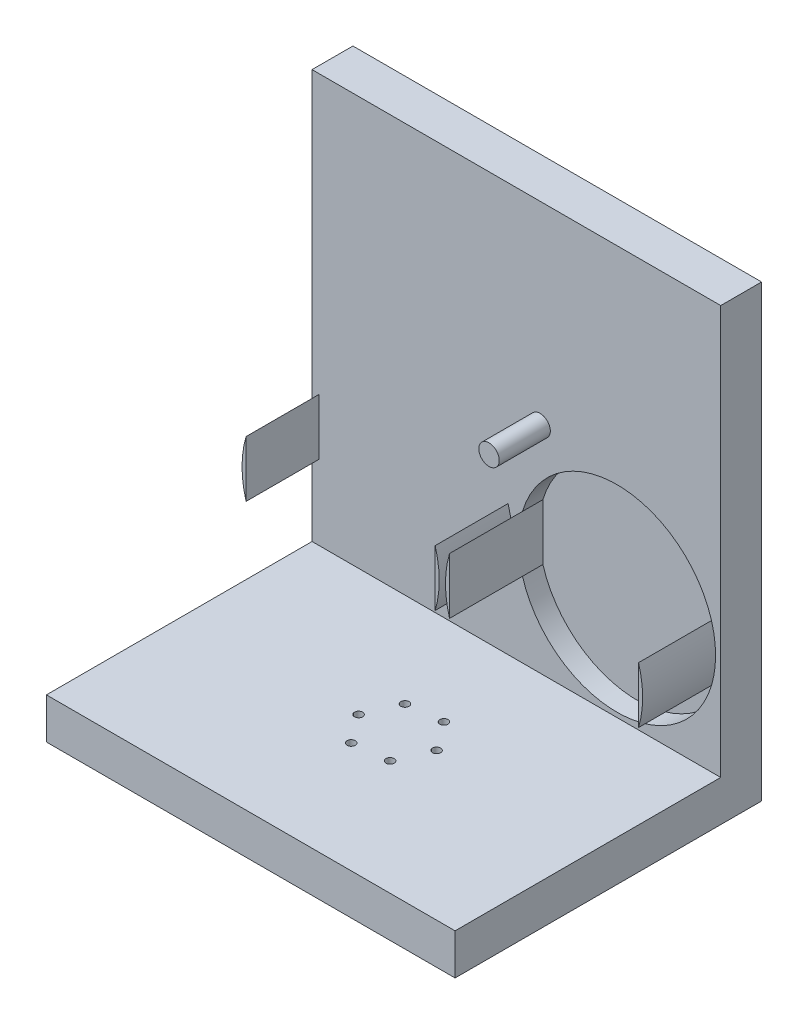
ISO-10303-21;
HEADER;
FILE_DESCRIPTION(('STEP AP214'),'2;1');
FILE_NAME('part.step','',(''),(''),'','','');
FILE_SCHEMA(('AUTOMOTIVE_DESIGN { 1 0 10303 214 1 1 1 1 }'));
ENDSEC;
DATA;
#1=APPLICATION_CONTEXT('core data for automotive mechanical design processes');
#2=APPLICATION_PROTOCOL_DEFINITION('international standard','automotive_design',2000,#1);
#3=PRODUCT_CONTEXT('',#1,'mechanical');
#4=PRODUCT('Part','Part','',(#3));
#5=PRODUCT_RELATED_PRODUCT_CATEGORY('part','',(#4));
#6=PRODUCT_DEFINITION_FORMATION('','',#4);
#7=PRODUCT_DEFINITION_CONTEXT('part definition',#1,'design');
#8=PRODUCT_DEFINITION('design','',#6,#7);
#9=PRODUCT_DEFINITION_SHAPE('','',#8);
#10=(LENGTH_UNIT() NAMED_UNIT(*) SI_UNIT(.MILLI.,.METRE.));
#11=(NAMED_UNIT(*) PLANE_ANGLE_UNIT() SI_UNIT($,.RADIAN.));
#12=(NAMED_UNIT(*) SI_UNIT($,.STERADIAN.) SOLID_ANGLE_UNIT());
#13=UNCERTAINTY_MEASURE_WITH_UNIT(LENGTH_MEASURE(1.E-05),#10,'distance_accuracy_value','');
#14=(GEOMETRIC_REPRESENTATION_CONTEXT(3) GLOBAL_UNCERTAINTY_ASSIGNED_CONTEXT((#13)) GLOBAL_UNIT_ASSIGNED_CONTEXT((#10,
#11,#12)) REPRESENTATION_CONTEXT('',''));
#15=CARTESIAN_POINT('',(0.,0.,0.));
#16=DIRECTION('',(0.,0.,1.));
#17=DIRECTION('',(1.,0.,0.));
#18=AXIS2_PLACEMENT_3D('',#15,#16,#17);
#19=CARTESIAN_POINT('',(0.,0.,20.));
#20=DIRECTION('',(0.,0.,1.));
#21=DIRECTION('',(1.,0.,0.));
#22=AXIS2_PLACEMENT_3D('',#19,#20,#21);
#23=PLANE('',#22);
#24=CARTESIAN_POINT('',(9.77133348525452,4.58020606529596,20.));
#25=DIRECTION('',(0.,0.,1.));
#26=DIRECTION('',(1.,0.,0.));
#27=AXIS2_PLACEMENT_3D('',#24,#25,#26);
#28=CIRCLE('',#27,5.);
#29=CARTESIAN_POINT('',(14.7713334852545,4.58020606529596,20.));
#30=VERTEX_POINT('',#29);
#31=EDGE_CURVE('E191',#30,#30,#28,.T.);
#32=ORIENTED_EDGE('',*,*,#31,.F.);
#33=EDGE_LOOP('',(#32));
#34=FACE_BOUND('',#33,.T.);
#35=CARTESIAN_POINT('',(47.3974122046126,-50.0366645851304,20.));
#36=DIRECTION('',(0.,0.,1.));
#37=DIRECTION('',(-1.,0.,0.));
#38=AXIS2_PLACEMENT_3D('',#35,#36,#37);
#39=CIRCLE('',#38,48.25);
#40=CARTESIAN_POINT('',(93.6474122046126,-36.2889375002628,20.));
#41=VERTEX_POINT('',#40);
#42=CARTESIAN_POINT('',(1.14741220461258,-36.2889375002629,20.));
#43=VERTEX_POINT('',#42);
#44=EDGE_CURVE('E169',#41,#43,#39,.T.);
#45=ORIENTED_EDGE('',*,*,#44,.F.);
#46=CARTESIAN_POINT('',(47.3974122046126,-50.0366645851304,20.));
#47=DIRECTION('',(0.,0.,1.));
#48=DIRECTION('',(-1.,0.,0.));
#49=AXIS2_PLACEMENT_3D('',#46,#47,#48);
#50=CIRCLE('',#49,48.25);
#51=CARTESIAN_POINT('',(93.6474122046126,-63.7843916699977,20.));
#52=VERTEX_POINT('',#51);
#53=EDGE_CURVE('E318',#52,#41,#50,.T.);
#54=ORIENTED_EDGE('',*,*,#53,.F.);
#55=CARTESIAN_POINT('',(47.3974122046126,-50.0366645851304,20.));
#56=DIRECTION('',(0.,0.,1.));
#57=DIRECTION('',(1.,0.,0.));
#58=AXIS2_PLACEMENT_3D('',#55,#56,#57);
#59=CIRCLE('',#58,48.25);
#60=CARTESIAN_POINT('',(1.14741220461261,-63.784391669998,20.));
#61=VERTEX_POINT('',#60);
#62=EDGE_CURVE('E187',#61,#52,#59,.T.);
#63=ORIENTED_EDGE('',*,*,#62,.F.);
#64=CARTESIAN_POINT('',(47.3974122046126,-50.0366645851304,20.));
#65=DIRECTION('',(0.,0.,1.));
#66=DIRECTION('',(1.,0.,0.));
#67=AXIS2_PLACEMENT_3D('',#64,#65,#66);
#68=CIRCLE('',#67,48.25);
#69=EDGE_CURVE('E321',#43,#61,#68,.T.);
#70=ORIENTED_EDGE('',*,*,#69,.F.);
#71=EDGE_LOOP('',(#45,#54,#63,#70));
#72=FACE_BOUND('',#71,.T.);
#73=DIRECTION('',(0.,1.,0.));
#74=VECTOR('',#73,1.);
#75=CARTESIAN_POINT('',(-98.4013600185397,-36.4686284248534,20.));
#76=LINE('',#75,#74);
#77=CARTESIAN_POINT('',(-98.4013600185397,-63.9640825945885,20.));
#78=VERTEX_POINT('',#77);
#79=CARTESIAN_POINT('',(-98.4013600185397,-36.4686284248534,20.));
#80=VERTEX_POINT('',#79);
#81=EDGE_CURVE('E301',#78,#80,#76,.T.);
#82=ORIENTED_EDGE('',*,*,#81,.F.);
#83=CARTESIAN_POINT('',(-52.1513600185397,-50.2163555097209,20.));
#84=DIRECTION('',(0.,0.,1.));
#85=DIRECTION('',(1.,0.,0.));
#86=AXIS2_PLACEMENT_3D('',#83,#84,#85);
#87=CIRCLE('',#86,48.25);
#88=EDGE_CURVE('E293',#80,#78,#87,.T.);
#89=ORIENTED_EDGE('',*,*,#88,.F.);
#90=EDGE_LOOP('',(#82,#89));
#91=FACE_BOUND('',#90,.T.);
#92=DIRECTION('',(0.,-1.,0.));
#93=VECTOR('',#92,1.);
#94=CARTESIAN_POINT('',(-5.90136001853973,-36.4686284248534,20.));
#95=LINE('',#94,#93);
#96=CARTESIAN_POINT('',(-5.90136001853973,-36.4686284248534,20.));
#97=VERTEX_POINT('',#96);
#98=CARTESIAN_POINT('',(-5.90136001853975,-63.9640825945885,20.));
#99=VERTEX_POINT('',#98);
#100=EDGE_CURVE('E288',#97,#99,#95,.T.);
#101=ORIENTED_EDGE('',*,*,#100,.F.);
#102=CARTESIAN_POINT('',(-52.1513600185397,-50.2163555097209,20.));
#103=DIRECTION('',(0.,0.,1.));
#104=DIRECTION('',(-1.,0.,0.));
#105=AXIS2_PLACEMENT_3D('',#102,#103,#104);
#106=CIRCLE('',#105,48.25);
#107=EDGE_CURVE('E290',#99,#97,#106,.T.);
#108=ORIENTED_EDGE('',*,*,#107,.F.);
#109=EDGE_LOOP('',(#101,#108));
#110=FACE_BOUND('',#109,.T.);
#111=DIRECTION('',(0.,-1.,0.));
#112=VECTOR('',#111,1.);
#113=CARTESIAN_POINT('',(-101.837901133192,99.46818513956,20.));
#114=LINE('',#113,#112);
#115=CARTESIAN_POINT('',(-101.837901133192,99.46818513956,20.));
#116=VERTEX_POINT('',#115);
#117=CARTESIAN_POINT('',(-101.837901133192,-100.53181486044,20.));
#118=VERTEX_POINT('',#117);
#119=EDGE_CURVE('E54',#116,#118,#114,.T.);
#120=ORIENTED_EDGE('',*,*,#119,.T.);
#121=DIRECTION('',(-1.,0.,0.));
#122=VECTOR('',#121,1.);
#123=CARTESIAN_POINT('',(-101.837901133192,-100.53181486044,20.));
#124=LINE('',#123,#122);
#125=CARTESIAN_POINT('',(98.1620988668081,-100.53181486044,20.));
#126=VERTEX_POINT('',#125);
#127=EDGE_CURVE('E58',#126,#118,#124,.T.);
#128=ORIENTED_EDGE('',*,*,#127,.F.);
#129=DIRECTION('',(0.,1.,0.));
#130=VECTOR('',#129,1.);
#131=CARTESIAN_POINT('',(98.162098866808,99.46818513956,20.));
#132=LINE('',#131,#130);
#133=CARTESIAN_POINT('',(98.162098866808,99.46818513956,20.));
#134=VERTEX_POINT('',#133);
#135=EDGE_CURVE('E339',#126,#134,#132,.T.);
#136=ORIENTED_EDGE('',*,*,#135,.T.);
#137=DIRECTION('',(-1.,0.,0.));
#138=VECTOR('',#137,1.);
#139=CARTESIAN_POINT('',(-101.837901133192,99.46818513956,20.));
#140=LINE('',#139,#138);
#141=EDGE_CURVE('E342',#134,#116,#140,.T.);
#142=ORIENTED_EDGE('',*,*,#141,.T.);
#143=EDGE_LOOP('',(#120,#128,#136,#142));
#144=FACE_BOUND('',#143,.T.);
#145=ADVANCED_FACE('F39',(#34,#72,#91,#110,#144),#23,.T.);
#146=CARTESIAN_POINT('',(-101.837901133192,99.46818513956,20.));
#147=DIRECTION('',(1.,0.,0.));
#148=DIRECTION('',(0.,1.,0.));
#149=AXIS2_PLACEMENT_3D('',#146,#147,#148);
#150=PLANE('',#149);
#151=DIRECTION('',(0.,-1.,0.));
#152=VECTOR('',#151,1.);
#153=CARTESIAN_POINT('',(-101.837901133192,99.46818513956,0.));
#154=LINE('',#153,#152);
#155=CARTESIAN_POINT('',(-101.837901133192,99.46818513956,0.));
#156=VERTEX_POINT('',#155);
#157=CARTESIAN_POINT('',(-101.837901133192,-120.529614348531,0.));
#158=VERTEX_POINT('',#157);
#159=EDGE_CURVE('E337',#156,#158,#154,.T.);
#160=ORIENTED_EDGE('',*,*,#159,.T.);
#161=DIRECTION('',(0.,0.,-1.));
#162=VECTOR('',#161,1.);
#163=CARTESIAN_POINT('',(-101.837901133192,-120.529614348531,20.));
#164=LINE('',#163,#162);
#165=CARTESIAN_POINT('',(-101.837901133192,-120.529614348531,20.));
#166=VERTEX_POINT('',#165);
#167=EDGE_CURVE('E270',#166,#158,#164,.T.);
#168=ORIENTED_EDGE('',*,*,#167,.F.);
#169=DIRECTION('',(0.,-1.,0.));
#170=VECTOR('',#169,1.);
#171=CARTESIAN_POINT('',(-101.837901133192,-100.53181486044,20.));
#172=LINE('',#171,#170);
#173=CARTESIAN_POINT('',(-101.837901133192,-120.53181486044,20.));
#174=VERTEX_POINT('',#173);
#175=EDGE_CURVE('E208',#166,#174,#172,.T.);
#176=ORIENTED_EDGE('',*,*,#175,.T.);
#177=DIRECTION('',(0.,0.,-1.));
#178=VECTOR('',#177,1.);
#179=CARTESIAN_POINT('',(-101.837901133192,-120.53181486044,150.));
#180=LINE('',#179,#178);
#181=CARTESIAN_POINT('',(-101.837901133192,-120.53181486044,150.));
#182=VERTEX_POINT('',#181);
#183=EDGE_CURVE('E266',#182,#174,#180,.T.);
#184=ORIENTED_EDGE('',*,*,#183,.F.);
#185=DIRECTION('',(0.,-1.,0.));
#186=VECTOR('',#185,1.);
#187=CARTESIAN_POINT('',(-101.837901133192,-100.53181486044,150.));
#188=LINE('',#187,#186);
#189=CARTESIAN_POINT('',(-101.837901133192,-100.53181486044,150.));
#190=VERTEX_POINT('',#189);
#191=EDGE_CURVE('E241',#190,#182,#188,.T.);
#192=ORIENTED_EDGE('',*,*,#191,.F.);
#193=DIRECTION('',(0.,0.,-1.));
#194=VECTOR('',#193,1.);
#195=CARTESIAN_POINT('',(-101.837901133192,-100.53181486044,150.));
#196=LINE('',#195,#194);
#197=EDGE_CURVE('E250',#190,#118,#196,.T.);
#198=ORIENTED_EDGE('',*,*,#197,.T.);
#199=ORIENTED_EDGE('',*,*,#119,.F.);
#200=DIRECTION('',(0.,0.,-1.));
#201=VECTOR('',#200,1.);
#202=CARTESIAN_POINT('',(-101.837901133192,99.46818513956,20.));
#203=LINE('',#202,#201);
#204=EDGE_CURVE('E47',#116,#156,#203,.T.);
#205=ORIENTED_EDGE('',*,*,#204,.T.);
#206=EDGE_LOOP('',(#160,#168,#176,#184,#192,#198,#199,#205));
#207=FACE_BOUND('',#206,.T.);
#208=ADVANCED_FACE('F41',(#207),#150,.F.);
#209=CARTESIAN_POINT('',(98.162098866808,99.46818513956,20.));
#210=DIRECTION('',(-1.,0.,0.));
#211=DIRECTION('',(0.,-1.,0.));
#212=AXIS2_PLACEMENT_3D('',#209,#210,#211);
#213=PLANE('',#212);
#214=DIRECTION('',(0.,1.,0.));
#215=VECTOR('',#214,1.);
#216=CARTESIAN_POINT('',(98.162098866808,99.46818513956,0.));
#217=LINE('',#216,#215);
#218=CARTESIAN_POINT('',(98.1620988668081,-120.529614348531,0.));
#219=VERTEX_POINT('',#218);
#220=CARTESIAN_POINT('',(98.162098866808,99.46818513956,0.));
#221=VERTEX_POINT('',#220);
#222=EDGE_CURVE('E345',#219,#221,#217,.T.);
#223=ORIENTED_EDGE('',*,*,#222,.T.);
#224=DIRECTION('',(0.,0.,-1.));
#225=VECTOR('',#224,1.);
#226=CARTESIAN_POINT('',(98.162098866808,99.46818513956,20.));
#227=LINE('',#226,#225);
#228=EDGE_CURVE('E11',#134,#221,#227,.T.);
#229=ORIENTED_EDGE('',*,*,#228,.F.);
#230=ORIENTED_EDGE('',*,*,#135,.F.);
#231=DIRECTION('',(0.,0.,-1.));
#232=VECTOR('',#231,1.);
#233=CARTESIAN_POINT('',(98.1620988668081,-100.53181486044,150.));
#234=LINE('',#233,#232);
#235=CARTESIAN_POINT('',(98.1620988668081,-100.53181486044,150.));
#236=VERTEX_POINT('',#235);
#237=EDGE_CURVE('E260',#236,#126,#234,.T.);
#238=ORIENTED_EDGE('',*,*,#237,.F.);
#239=DIRECTION('',(0.,1.,0.));
#240=VECTOR('',#239,1.);
#241=CARTESIAN_POINT('',(98.1620988668081,-100.53181486044,150.));
#242=LINE('',#241,#240);
#243=CARTESIAN_POINT('',(98.1620988668081,-120.53181486044,150.));
#244=VERTEX_POINT('',#243);
#245=EDGE_CURVE('E246',#244,#236,#242,.T.);
#246=ORIENTED_EDGE('',*,*,#245,.F.);
#247=DIRECTION('',(0.,0.,-1.));
#248=VECTOR('',#247,1.);
#249=CARTESIAN_POINT('',(98.1620988668081,-120.53181486044,150.));
#250=LINE('',#249,#248);
#251=CARTESIAN_POINT('',(98.1620988668081,-120.53181486044,20.));
#252=VERTEX_POINT('',#251);
#253=EDGE_CURVE('E263',#244,#252,#250,.T.);
#254=ORIENTED_EDGE('',*,*,#253,.T.);
#255=DIRECTION('',(0.,1.,0.));
#256=VECTOR('',#255,1.);
#257=CARTESIAN_POINT('',(98.1620988668081,-100.53181486044,20.));
#258=LINE('',#257,#256);
#259=CARTESIAN_POINT('',(98.1620988668081,-120.529614348531,20.));
#260=VERTEX_POINT('',#259);
#261=EDGE_CURVE('E254',#252,#260,#258,.T.);
#262=ORIENTED_EDGE('',*,*,#261,.T.);
#263=DIRECTION('',(0.,0.,-1.));
#264=VECTOR('',#263,1.);
#265=CARTESIAN_POINT('',(98.1620988668081,-120.529614348531,20.));
#266=LINE('',#265,#264);
#267=EDGE_CURVE('E269',#260,#219,#266,.T.);
#268=ORIENTED_EDGE('',*,*,#267,.T.);
#269=EDGE_LOOP('',(#223,#229,#230,#238,#246,#254,#262,#268));
#270=FACE_BOUND('',#269,.T.);
#271=ADVANCED_FACE('F379',(#270),#213,.F.);
#272=CARTESIAN_POINT('',(-101.837901133192,99.46818513956,20.));
#273=DIRECTION('',(0.,-1.,0.));
#274=DIRECTION('',(0.,0.,-1.));
#275=AXIS2_PLACEMENT_3D('',#272,#273,#274);
#276=PLANE('',#275);
#277=DIRECTION('',(-1.,0.,0.));
#278=VECTOR('',#277,1.);
#279=CARTESIAN_POINT('',(-101.837901133192,99.46818513956,0.));
#280=LINE('',#279,#278);
#281=EDGE_CURVE('E340',#221,#156,#280,.T.);
#282=ORIENTED_EDGE('',*,*,#281,.T.);
#283=ORIENTED_EDGE('',*,*,#204,.F.);
#284=ORIENTED_EDGE('',*,*,#141,.F.);
#285=ORIENTED_EDGE('',*,*,#228,.T.);
#286=EDGE_LOOP('',(#282,#283,#284,#285));
#287=FACE_BOUND('',#286,.T.);
#288=ADVANCED_FACE('F381',(#287),#276,.F.);
#289=CARTESIAN_POINT('',(0.,0.,0.));
#290=DIRECTION('',(0.,0.,1.));
#291=DIRECTION('',(1.,0.,0.));
#292=AXIS2_PLACEMENT_3D('',#289,#290,#291);
#293=PLANE('',#292);
#294=ORIENTED_EDGE('',*,*,#159,.F.);
#295=ORIENTED_EDGE('',*,*,#281,.F.);
#296=ORIENTED_EDGE('',*,*,#222,.F.);
#297=DIRECTION('',(1.,0.,0.));
#298=VECTOR('',#297,1.);
#299=CARTESIAN_POINT('',(-101.837901133192,-120.529614348531,0.));
#300=LINE('',#299,#298);
#301=EDGE_CURVE('E276',#158,#219,#300,.T.);
#302=ORIENTED_EDGE('',*,*,#301,.F.);
#303=EDGE_LOOP('',(#294,#295,#296,#302));
#304=FACE_BOUND('',#303,.T.);
#305=ADVANCED_FACE('F357',(#304),#293,.F.);
#306=CARTESIAN_POINT('',(47.3974122046126,-50.0366645851304,55.7));
#307=DIRECTION('',(0.,0.,-1.));
#308=DIRECTION('',(-1.,0.,0.));
#309=AXIS2_PLACEMENT_3D('',#306,#307,#308);
#310=CYLINDRICAL_SURFACE('',#309,48.25);
#311=ORIENTED_EDGE('',*,*,#69,.T.);
#312=DIRECTION('',(0.,0.,-1.));
#313=VECTOR('',#312,1.);
#314=CARTESIAN_POINT('',(1.14741220461261,-63.784391669998,55.7));
#315=LINE('',#314,#313);
#316=CARTESIAN_POINT('',(1.14741220461261,-63.784391669998,55.7));
#317=VERTEX_POINT('',#316);
#318=EDGE_CURVE('E335',#317,#61,#315,.T.);
#319=ORIENTED_EDGE('',*,*,#318,.F.);
#320=CARTESIAN_POINT('',(47.3974122046126,-50.0366645851304,55.7));
#321=DIRECTION('',(0.,0.,1.));
#322=DIRECTION('',(1.,0.,0.));
#323=AXIS2_PLACEMENT_3D('',#320,#321,#322);
#324=CIRCLE('',#323,48.25);
#325=CARTESIAN_POINT('',(1.14741220461258,-36.2889375002629,55.7));
#326=VERTEX_POINT('',#325);
#327=EDGE_CURVE('E326',#326,#317,#324,.T.);
#328=ORIENTED_EDGE('',*,*,#327,.F.);
#329=DIRECTION('',(0.,0.,-1.));
#330=VECTOR('',#329,1.);
#331=CARTESIAN_POINT('',(1.14741220461258,-36.2889375002629,55.7));
#332=LINE('',#331,#330);
#333=EDGE_CURVE('E331',#326,#43,#332,.T.);
#334=ORIENTED_EDGE('',*,*,#333,.T.);
#335=EDGE_LOOP('',(#311,#319,#328,#334));
#336=FACE_BOUND('',#335,.T.);
#337=ADVANCED_FACE('F388',(#336),#310,.T.);
#338=CARTESIAN_POINT('',(1.14741220461258,-36.2889375002629,55.7));
#339=DIRECTION('',(-1.,0.,0.));
#340=DIRECTION('',(0.,-1.,0.));
#341=AXIS2_PLACEMENT_3D('',#338,#339,#340);
#342=PLANE('',#341);
#343=ORIENTED_EDGE('',*,*,#318,.T.);
#344=DIRECTION('',(0.,0.,1.));
#345=VECTOR('',#344,1.);
#346=CARTESIAN_POINT('',(1.14741220461261,-63.784391669998,10.));
#347=LINE('',#346,#345);
#348=CARTESIAN_POINT('',(1.14741220461261,-63.784391669998,10.));
#349=VERTEX_POINT('',#348);
#350=EDGE_CURVE('E173',#349,#61,#347,.T.);
#351=ORIENTED_EDGE('',*,*,#350,.F.);
#352=DIRECTION('',(0.,-1.,0.));
#353=VECTOR('',#352,1.);
#354=CARTESIAN_POINT('',(1.14741220461258,-36.2889375002629,10.));
#355=LINE('',#354,#353);
#356=CARTESIAN_POINT('',(1.14741220461258,-36.2889375002629,10.));
#357=VERTEX_POINT('',#356);
#358=EDGE_CURVE('E177',#357,#349,#355,.T.);
#359=ORIENTED_EDGE('',*,*,#358,.F.);
#360=DIRECTION('',(0.,0.,1.));
#361=VECTOR('',#360,1.);
#362=CARTESIAN_POINT('',(1.14741220461258,-36.2889375002629,10.));
#363=LINE('',#362,#361);
#364=EDGE_CURVE('E162',#357,#43,#363,.T.);
#365=ORIENTED_EDGE('',*,*,#364,.T.);
#366=ORIENTED_EDGE('',*,*,#333,.F.);
#367=DIRECTION('',(0.,1.,0.));
#368=VECTOR('',#367,1.);
#369=CARTESIAN_POINT('',(1.14741220461258,-36.2889375002629,55.7));
#370=LINE('',#369,#368);
#371=EDGE_CURVE('E329',#317,#326,#370,.T.);
#372=ORIENTED_EDGE('',*,*,#371,.F.);
#373=EDGE_LOOP('',(#343,#351,#359,#365,#366,#372));
#374=FACE_BOUND('',#373,.T.);
#375=ADVANCED_FACE('F179',(#374),#342,.F.);
#376=CARTESIAN_POINT('',(47.3974122046126,-50.0366645851304,55.7));
#377=DIRECTION('',(0.,0.,1.));
#378=DIRECTION('',(1.,0.,0.));
#379=AXIS2_PLACEMENT_3D('',#376,#377,#378);
#380=PLANE('',#379);
#381=ORIENTED_EDGE('',*,*,#327,.T.);
#382=ORIENTED_EDGE('',*,*,#371,.T.);
#383=EDGE_LOOP('',(#381,#382));
#384=FACE_BOUND('',#383,.T.);
#385=ADVANCED_FACE('F407',(#384),#380,.T.);
#386=CARTESIAN_POINT('',(47.3974122046126,-50.0366645851304,55.7));
#387=DIRECTION('',(0.,0.,-1.));
#388=DIRECTION('',(-1.,0.,0.));
#389=AXIS2_PLACEMENT_3D('',#386,#387,#388);
#390=CYLINDRICAL_SURFACE('',#389,48.25);
#391=ORIENTED_EDGE('',*,*,#53,.T.);
#392=DIRECTION('',(0.,0.,-1.));
#393=VECTOR('',#392,1.);
#394=CARTESIAN_POINT('',(93.6474122046126,-36.2889375002629,55.7));
#395=LINE('',#394,#393);
#396=CARTESIAN_POINT('',(93.6474122046126,-36.2889375002629,55.7));
#397=VERTEX_POINT('',#396);
#398=EDGE_CURVE('E311',#397,#41,#395,.T.);
#399=ORIENTED_EDGE('',*,*,#398,.F.);
#400=CARTESIAN_POINT('',(47.3974122046126,-50.0366645851304,55.7));
#401=DIRECTION('',(0.,0.,1.));
#402=DIRECTION('',(-1.,0.,0.));
#403=AXIS2_PLACEMENT_3D('',#400,#401,#402);
#404=CIRCLE('',#403,48.25);
#405=CARTESIAN_POINT('',(93.6474122046126,-63.7843916699977,55.7));
#406=VERTEX_POINT('',#405);
#407=EDGE_CURVE('E322',#406,#397,#404,.T.);
#408=ORIENTED_EDGE('',*,*,#407,.F.);
#409=DIRECTION('',(0.,0.,-1.));
#410=VECTOR('',#409,1.);
#411=CARTESIAN_POINT('',(93.6474122046126,-63.7843916699977,55.7));
#412=LINE('',#411,#410);
#413=EDGE_CURVE('E314',#406,#52,#412,.T.);
#414=ORIENTED_EDGE('',*,*,#413,.T.);
#415=EDGE_LOOP('',(#391,#399,#408,#414));
#416=FACE_BOUND('',#415,.T.);
#417=ADVANCED_FACE('F409',(#416),#390,.T.);
#418=CARTESIAN_POINT('',(93.6474122046126,-36.2889375002629,55.7));
#419=DIRECTION('',(1.,0.,0.));
#420=DIRECTION('',(0.,1.,0.));
#421=AXIS2_PLACEMENT_3D('',#418,#419,#420);
#422=PLANE('',#421);
#423=ORIENTED_EDGE('',*,*,#398,.T.);
#424=DIRECTION('',(0.,0.,1.));
#425=VECTOR('',#424,1.);
#426=CARTESIAN_POINT('',(93.6474122046126,-36.2889375002628,10.));
#427=LINE('',#426,#425);
#428=CARTESIAN_POINT('',(93.6474122046126,-36.2889375002628,10.));
#429=VERTEX_POINT('',#428);
#430=EDGE_CURVE('E198',#429,#41,#427,.T.);
#431=ORIENTED_EDGE('',*,*,#430,.F.);
#432=DIRECTION('',(0.,1.,0.));
#433=VECTOR('',#432,1.);
#434=CARTESIAN_POINT('',(93.6474122046126,-36.2889375002628,10.));
#435=LINE('',#434,#433);
#436=CARTESIAN_POINT('',(93.6474122046126,-63.7843916699978,10.));
#437=VERTEX_POINT('',#436);
#438=EDGE_CURVE('E174',#437,#429,#435,.T.);
#439=ORIENTED_EDGE('',*,*,#438,.F.);
#440=DIRECTION('',(0.,0.,1.));
#441=VECTOR('',#440,1.);
#442=CARTESIAN_POINT('',(93.6474122046126,-63.7843916699978,10.));
#443=LINE('',#442,#441);
#444=EDGE_CURVE('E201',#437,#52,#443,.T.);
#445=ORIENTED_EDGE('',*,*,#444,.T.);
#446=ORIENTED_EDGE('',*,*,#413,.F.);
#447=DIRECTION('',(0.,-1.,0.));
#448=VECTOR('',#447,1.);
#449=CARTESIAN_POINT('',(93.6474122046126,-36.2889375002629,55.7));
#450=LINE('',#449,#448);
#451=EDGE_CURVE('E317',#397,#406,#450,.T.);
#452=ORIENTED_EDGE('',*,*,#451,.F.);
#453=EDGE_LOOP('',(#423,#431,#439,#445,#446,#452));
#454=FACE_BOUND('',#453,.T.);
#455=ADVANCED_FACE('F415',(#454),#422,.F.);
#456=CARTESIAN_POINT('',(47.3974122046126,-50.0366645851304,55.7));
#457=DIRECTION('',(0.,0.,-1.));
#458=DIRECTION('',(-1.,0.,0.));
#459=AXIS2_PLACEMENT_3D('',#456,#457,#458);
#460=PLANE('',#459);
#461=ORIENTED_EDGE('',*,*,#407,.T.);
#462=ORIENTED_EDGE('',*,*,#451,.T.);
#463=EDGE_LOOP('',(#461,#462));
#464=FACE_BOUND('',#463,.T.);
#465=ADVANCED_FACE('F411',(#464),#460,.F.);
#466=CARTESIAN_POINT('',(-52.1513600185397,-50.2163555097209,55.7));
#467=DIRECTION('',(0.,0.,-1.));
#468=DIRECTION('',(-1.,0.,0.));
#469=AXIS2_PLACEMENT_3D('',#466,#467,#468);
#470=CYLINDRICAL_SURFACE('',#469,48.25);
#471=ORIENTED_EDGE('',*,*,#88,.T.);
#472=DIRECTION('',(0.,0.,-1.));
#473=VECTOR('',#472,1.);
#474=CARTESIAN_POINT('',(-98.4013600185397,-63.9640825945885,55.7));
#475=LINE('',#474,#473);
#476=CARTESIAN_POINT('',(-98.4013600185397,-63.9640825945885,55.7));
#477=VERTEX_POINT('',#476);
#478=EDGE_CURVE('E308',#477,#78,#475,.T.);
#479=ORIENTED_EDGE('',*,*,#478,.F.);
#480=CARTESIAN_POINT('',(-52.1513600185397,-50.2163555097209,55.7));
#481=DIRECTION('',(0.,0.,1.));
#482=DIRECTION('',(1.,0.,0.));
#483=AXIS2_PLACEMENT_3D('',#480,#481,#482);
#484=CIRCLE('',#483,48.25);
#485=CARTESIAN_POINT('',(-98.4013600185397,-36.4686284248534,55.7));
#486=VERTEX_POINT('',#485);
#487=EDGE_CURVE('E297',#486,#477,#484,.T.);
#488=ORIENTED_EDGE('',*,*,#487,.F.);
#489=DIRECTION('',(0.,0.,-1.));
#490=VECTOR('',#489,1.);
#491=CARTESIAN_POINT('',(-98.4013600185397,-36.4686284248534,55.7));
#492=LINE('',#491,#490);
#493=EDGE_CURVE('E303',#486,#80,#492,.T.);
#494=ORIENTED_EDGE('',*,*,#493,.T.);
#495=EDGE_LOOP('',(#471,#479,#488,#494));
#496=FACE_BOUND('',#495,.T.);
#497=ADVANCED_FACE('F414',(#496),#470,.T.);
#498=CARTESIAN_POINT('',(-98.4013600185397,-36.4686284248534,55.7));
#499=DIRECTION('',(-1.,0.,0.));
#500=DIRECTION('',(0.,-1.,0.));
#501=AXIS2_PLACEMENT_3D('',#498,#499,#500);
#502=PLANE('',#501);
#503=ORIENTED_EDGE('',*,*,#81,.T.);
#504=ORIENTED_EDGE('',*,*,#493,.F.);
#505=DIRECTION('',(0.,1.,0.));
#506=VECTOR('',#505,1.);
#507=CARTESIAN_POINT('',(-98.4013600185397,-36.4686284248534,55.7));
#508=LINE('',#507,#506);
#509=EDGE_CURVE('E300',#477,#486,#508,.T.);
#510=ORIENTED_EDGE('',*,*,#509,.F.);
#511=ORIENTED_EDGE('',*,*,#478,.T.);
#512=EDGE_LOOP('',(#503,#504,#510,#511));
#513=FACE_BOUND('',#512,.T.);
#514=ADVANCED_FACE('F425',(#513),#502,.F.);
#515=CARTESIAN_POINT('',(-52.1513600185397,-50.2163555097209,55.7));
#516=DIRECTION('',(0.,0.,1.));
#517=DIRECTION('',(1.,0.,0.));
#518=AXIS2_PLACEMENT_3D('',#515,#516,#517);
#519=PLANE('',#518);
#520=ORIENTED_EDGE('',*,*,#487,.T.);
#521=ORIENTED_EDGE('',*,*,#509,.T.);
#522=EDGE_LOOP('',(#520,#521));
#523=FACE_BOUND('',#522,.T.);
#524=ADVANCED_FACE('F429',(#523),#519,.T.);
#525=CARTESIAN_POINT('',(-52.1513600185397,-50.2163555097209,55.7));
#526=DIRECTION('',(0.,0.,-1.));
#527=DIRECTION('',(-1.,0.,0.));
#528=AXIS2_PLACEMENT_3D('',#525,#526,#527);
#529=CYLINDRICAL_SURFACE('',#528,48.25);
#530=ORIENTED_EDGE('',*,*,#107,.T.);
#531=DIRECTION('',(0.,0.,-1.));
#532=VECTOR('',#531,1.);
#533=CARTESIAN_POINT('',(-5.90136001853973,-36.4686284248534,55.7));
#534=LINE('',#533,#532);
#535=CARTESIAN_POINT('',(-5.90136001853973,-36.4686284248534,55.7));
#536=VERTEX_POINT('',#535);
#537=EDGE_CURVE('E279',#536,#97,#534,.T.);
#538=ORIENTED_EDGE('',*,*,#537,.F.);
#539=CARTESIAN_POINT('',(-52.1513600185397,-50.2163555097209,55.7));
#540=DIRECTION('',(0.,0.,1.));
#541=DIRECTION('',(-1.,0.,0.));
#542=AXIS2_PLACEMENT_3D('',#539,#540,#541);
#543=CIRCLE('',#542,48.25);
#544=CARTESIAN_POINT('',(-5.90136001853975,-63.9640825945885,55.7));
#545=VERTEX_POINT('',#544);
#546=EDGE_CURVE('E291',#545,#536,#543,.T.);
#547=ORIENTED_EDGE('',*,*,#546,.F.);
#548=DIRECTION('',(0.,0.,-1.));
#549=VECTOR('',#548,1.);
#550=CARTESIAN_POINT('',(-5.90136001853975,-63.9640825945885,55.7));
#551=LINE('',#550,#549);
#552=EDGE_CURVE('E284',#545,#99,#551,.T.);
#553=ORIENTED_EDGE('',*,*,#552,.T.);
#554=EDGE_LOOP('',(#530,#538,#547,#553));
#555=FACE_BOUND('',#554,.T.);
#556=ADVANCED_FACE('F433',(#555),#529,.T.);
#557=CARTESIAN_POINT('',(-5.90136001853973,-36.4686284248534,55.7));
#558=DIRECTION('',(1.,0.,0.));
#559=DIRECTION('',(0.,1.,0.));
#560=AXIS2_PLACEMENT_3D('',#557,#558,#559);
#561=PLANE('',#560);
#562=ORIENTED_EDGE('',*,*,#100,.T.);
#563=ORIENTED_EDGE('',*,*,#552,.F.);
#564=DIRECTION('',(0.,-1.,0.));
#565=VECTOR('',#564,1.);
#566=CARTESIAN_POINT('',(-5.90136001853973,-36.4686284248534,55.7));
#567=LINE('',#566,#565);
#568=EDGE_CURVE('E287',#536,#545,#567,.T.);
#569=ORIENTED_EDGE('',*,*,#568,.F.);
#570=ORIENTED_EDGE('',*,*,#537,.T.);
#571=EDGE_LOOP('',(#562,#563,#569,#570));
#572=FACE_BOUND('',#571,.T.);
#573=ADVANCED_FACE('F438',(#572),#561,.F.);
#574=CARTESIAN_POINT('',(-52.1513600185397,-50.2163555097209,55.7));
#575=DIRECTION('',(0.,0.,-1.));
#576=DIRECTION('',(-1.,0.,0.));
#577=AXIS2_PLACEMENT_3D('',#574,#575,#576);
#578=PLANE('',#577);
#579=ORIENTED_EDGE('',*,*,#546,.T.);
#580=ORIENTED_EDGE('',*,*,#568,.T.);
#581=EDGE_LOOP('',(#579,#580));
#582=FACE_BOUND('',#581,.T.);
#583=ADVANCED_FACE('F435',(#582),#578,.F.);
#584=CARTESIAN_POINT('',(-101.837901133192,-120.529614348531,20.));
#585=DIRECTION('',(0.,-1.,0.));
#586=DIRECTION('',(0.,0.,-1.));
#587=AXIS2_PLACEMENT_3D('',#584,#585,#586);
#588=PLANE('',#587);
#589=ORIENTED_EDGE('',*,*,#267,.F.);
#590=DIRECTION('',(1.,0.,0.));
#591=VECTOR('',#590,1.);
#592=CARTESIAN_POINT('',(-101.837901133192,-120.529614348531,20.));
#593=LINE('',#592,#591);
#594=EDGE_CURVE('E273',#166,#260,#593,.T.);
#595=ORIENTED_EDGE('',*,*,#594,.F.);
#596=ORIENTED_EDGE('',*,*,#167,.T.);
#597=ORIENTED_EDGE('',*,*,#301,.T.);
#598=EDGE_LOOP('',(#589,#595,#596,#597));
#599=FACE_BOUND('',#598,.T.);
#600=ADVANCED_FACE('F359',(#599),#588,.T.);
#601=CARTESIAN_POINT('',(-101.837901133192,-120.53181486044,150.));
#602=DIRECTION('',(0.,1.,0.));
#603=DIRECTION('',(0.,0.,1.));
#604=AXIS2_PLACEMENT_3D('',#601,#602,#603);
#605=PLANE('',#604);
#606=CARTESIAN_POINT('',(-17.1398512286904,-120.53181486044,81.946278463723));
#607=DIRECTION('',(0.,1.,0.));
#608=DIRECTION('',(0.,0.,1.));
#609=AXIS2_PLACEMENT_3D('',#606,#607,#608);
#610=CIRCLE('',#609,2.);
#611=CARTESIAN_POINT('',(-17.1398512286904,-120.53181486044,83.946278463723));
#612=VERTEX_POINT('',#611);
#613=EDGE_CURVE('E205',#612,#612,#610,.T.);
#614=ORIENTED_EDGE('',*,*,#613,.T.);
#615=EDGE_LOOP('',(#614));
#616=FACE_BOUND('',#615,.T.);
#617=CARTESIAN_POINT('',(-6.88439902192238,-120.53181486044,95.8166858129935));
#618=DIRECTION('',(0.,1.,0.));
#619=DIRECTION('',(0.,0.,1.));
#620=AXIS2_PLACEMENT_3D('',#617,#618,#619);
#621=CIRCLE('',#620,2.00000000000001);
#622=CARTESIAN_POINT('',(-6.88439902192238,-120.53181486044,97.8166858129935));
#623=VERTEX_POINT('',#622);
#624=EDGE_CURVE('E200',#623,#623,#621,.T.);
#625=ORIENTED_EDGE('',*,*,#624,.T.);
#626=EDGE_LOOP('',(#625));
#627=FACE_BOUND('',#626,.T.);
#628=CARTESIAN_POINT('',(10.2554522067683,-120.53181486044,93.8704073492705));
#629=DIRECTION('',(0.,1.,0.));
#630=DIRECTION('',(0.,0.,1.));
#631=AXIS2_PLACEMENT_3D('',#628,#629,#630);
#632=CIRCLE('',#631,2.);
#633=CARTESIAN_POINT('',(10.2554522067683,-120.53181486044,95.8704073492705));
#634=VERTEX_POINT('',#633);
#635=EDGE_CURVE('E216',#634,#634,#632,.T.);
#636=ORIENTED_EDGE('',*,*,#635,.T.);
#637=EDGE_LOOP('',(#636));
#638=FACE_BOUND('',#637,.T.);
#639=CARTESIAN_POINT('',(17.1398512286909,-120.53181486044,78.053721536277));
#640=DIRECTION('',(0.,1.,0.));
#641=DIRECTION('',(0.,0.,1.));
#642=AXIS2_PLACEMENT_3D('',#639,#640,#641);
#643=CIRCLE('',#642,2.00000000000001);
#644=CARTESIAN_POINT('',(17.1398512286909,-120.53181486044,80.053721536277));
#645=VERTEX_POINT('',#644);
#646=EDGE_CURVE('E233',#645,#645,#643,.T.);
#647=ORIENTED_EDGE('',*,*,#646,.T.);
#648=EDGE_LOOP('',(#647));
#649=FACE_BOUND('',#648,.T.);
#650=CARTESIAN_POINT('',(6.88439902192283,-120.53181486044,64.1833141870065));
#651=DIRECTION('',(0.,1.,0.));
#652=DIRECTION('',(0.,0.,1.));
#653=AXIS2_PLACEMENT_3D('',#650,#651,#652);
#654=CIRCLE('',#653,2.);
#655=CARTESIAN_POINT('',(6.88439902192283,-120.53181486044,66.1833141870065));
#656=VERTEX_POINT('',#655);
#657=EDGE_CURVE('E227',#656,#656,#654,.T.);
#658=ORIENTED_EDGE('',*,*,#657,.T.);
#659=EDGE_LOOP('',(#658));
#660=FACE_BOUND('',#659,.T.);
#661=CARTESIAN_POINT('',(-10.2554522067678,-120.53181486044,66.1295926507295));
#662=DIRECTION('',(0.,1.,0.));
#663=DIRECTION('',(0.,0.,1.));
#664=AXIS2_PLACEMENT_3D('',#661,#662,#663);
#665=CIRCLE('',#664,2.00000000000001);
#666=CARTESIAN_POINT('',(-10.2554522067678,-120.53181486044,68.1295926507295));
#667=VERTEX_POINT('',#666);
#668=EDGE_CURVE('E221',#667,#667,#665,.T.);
#669=ORIENTED_EDGE('',*,*,#668,.T.);
#670=EDGE_LOOP('',(#669));
#671=FACE_BOUND('',#670,.T.);
#672=DIRECTION('',(1.,0.,0.));
#673=VECTOR('',#672,1.);
#674=CARTESIAN_POINT('',(-101.837901133192,-120.53181486044,20.));
#675=LINE('',#674,#673);
#676=EDGE_CURVE('E252',#174,#252,#675,.T.);
#677=ORIENTED_EDGE('',*,*,#676,.T.);
#678=ORIENTED_EDGE('',*,*,#253,.F.);
#679=DIRECTION('',(1.,0.,0.));
#680=VECTOR('',#679,1.);
#681=CARTESIAN_POINT('',(-101.837901133192,-120.53181486044,150.));
#682=LINE('',#681,#680);
#683=EDGE_CURVE('E244',#182,#244,#682,.T.);
#684=ORIENTED_EDGE('',*,*,#683,.F.);
#685=ORIENTED_EDGE('',*,*,#183,.T.);
#686=EDGE_LOOP('',(#677,#678,#684,#685));
#687=FACE_BOUND('',#686,.T.);
#688=ADVANCED_FACE('F368',(#616,#627,#638,#649,#660,#671,#687),#605,.F.);
#689=CARTESIAN_POINT('',(-101.837901133192,-100.53181486044,150.));
#690=DIRECTION('',(0.,-1.,0.));
#691=DIRECTION('',(0.,0.,-1.));
#692=AXIS2_PLACEMENT_3D('',#689,#690,#691);
#693=PLANE('',#692);
#694=CARTESIAN_POINT('',(-17.1398512286904,-100.53181486044,81.946278463723));
#695=DIRECTION('',(0.,1.,0.));
#696=DIRECTION('',(0.,0.,1.));
#697=AXIS2_PLACEMENT_3D('',#694,#695,#696);
#698=CIRCLE('',#697,2.);
#699=CARTESIAN_POINT('',(-17.1398512286904,-100.53181486044,83.946278463723));
#700=VERTEX_POINT('',#699);
#701=EDGE_CURVE('E209',#700,#700,#698,.T.);
#702=ORIENTED_EDGE('',*,*,#701,.F.);
#703=EDGE_LOOP('',(#702));
#704=FACE_BOUND('',#703,.T.);
#705=CARTESIAN_POINT('',(-6.88439902192238,-100.53181486044,95.8166858129935));
#706=DIRECTION('',(0.,1.,0.));
#707=DIRECTION('',(0.,0.,1.));
#708=AXIS2_PLACEMENT_3D('',#705,#706,#707);
#709=CIRCLE('',#708,2.00000000000001);
#710=CARTESIAN_POINT('',(-6.88439902192238,-100.53181486044,97.8166858129935));
#711=VERTEX_POINT('',#710);
#712=EDGE_CURVE('E213',#711,#711,#709,.T.);
#713=ORIENTED_EDGE('',*,*,#712,.F.);
#714=EDGE_LOOP('',(#713));
#715=FACE_BOUND('',#714,.T.);
#716=CARTESIAN_POINT('',(10.2554522067683,-100.53181486044,93.8704073492705));
#717=DIRECTION('',(0.,1.,0.));
#718=DIRECTION('',(0.,0.,1.));
#719=AXIS2_PLACEMENT_3D('',#716,#717,#718);
#720=CIRCLE('',#719,2.);
#721=CARTESIAN_POINT('',(10.2554522067683,-100.53181486044,95.8704073492705));
#722=VERTEX_POINT('',#721);
#723=EDGE_CURVE('E236',#722,#722,#720,.T.);
#724=ORIENTED_EDGE('',*,*,#723,.F.);
#725=EDGE_LOOP('',(#724));
#726=FACE_BOUND('',#725,.T.);
#727=CARTESIAN_POINT('',(17.1398512286909,-100.53181486044,78.053721536277));
#728=DIRECTION('',(0.,1.,0.));
#729=DIRECTION('',(0.,0.,1.));
#730=AXIS2_PLACEMENT_3D('',#727,#728,#729);
#731=CIRCLE('',#730,2.00000000000001);
#732=CARTESIAN_POINT('',(17.1398512286909,-100.53181486044,80.053721536277));
#733=VERTEX_POINT('',#732);
#734=EDGE_CURVE('E230',#733,#733,#731,.T.);
#735=ORIENTED_EDGE('',*,*,#734,.F.);
#736=EDGE_LOOP('',(#735));
#737=FACE_BOUND('',#736,.T.);
#738=CARTESIAN_POINT('',(6.88439902192283,-100.53181486044,64.1833141870065));
#739=DIRECTION('',(0.,1.,0.));
#740=DIRECTION('',(0.,0.,1.));
#741=AXIS2_PLACEMENT_3D('',#738,#739,#740);
#742=CIRCLE('',#741,2.);
#743=CARTESIAN_POINT('',(6.88439902192283,-100.53181486044,66.1833141870065));
#744=VERTEX_POINT('',#743);
#745=EDGE_CURVE('E224',#744,#744,#742,.T.);
#746=ORIENTED_EDGE('',*,*,#745,.F.);
#747=EDGE_LOOP('',(#746));
#748=FACE_BOUND('',#747,.T.);
#749=CARTESIAN_POINT('',(-10.2554522067678,-100.53181486044,66.1295926507295));
#750=DIRECTION('',(0.,1.,0.));
#751=DIRECTION('',(0.,0.,1.));
#752=AXIS2_PLACEMENT_3D('',#749,#750,#751);
#753=CIRCLE('',#752,2.00000000000001);
#754=CARTESIAN_POINT('',(-10.2554522067678,-100.53181486044,68.1295926507295));
#755=VERTEX_POINT('',#754);
#756=EDGE_CURVE('E212',#755,#755,#753,.T.);
#757=ORIENTED_EDGE('',*,*,#756,.F.);
#758=EDGE_LOOP('',(#757));
#759=FACE_BOUND('',#758,.T.);
#760=ORIENTED_EDGE('',*,*,#127,.T.);
#761=ORIENTED_EDGE('',*,*,#197,.F.);
#762=DIRECTION('',(-1.,0.,0.));
#763=VECTOR('',#762,1.);
#764=CARTESIAN_POINT('',(-101.837901133192,-100.53181486044,150.));
#765=LINE('',#764,#763);
#766=EDGE_CURVE('E248',#236,#190,#765,.T.);
#767=ORIENTED_EDGE('',*,*,#766,.F.);
#768=ORIENTED_EDGE('',*,*,#237,.T.);
#769=EDGE_LOOP('',(#760,#761,#767,#768));
#770=FACE_BOUND('',#769,.T.);
#771=ADVANCED_FACE('F377',(#704,#715,#726,#737,#748,#759,#770),#693,.F.);
#772=CARTESIAN_POINT('',(0.,0.,150.));
#773=DIRECTION('',(0.,0.,1.));
#774=DIRECTION('',(1.,0.,0.));
#775=AXIS2_PLACEMENT_3D('',#772,#773,#774);
#776=PLANE('',#775);
#777=ORIENTED_EDGE('',*,*,#191,.T.);
#778=ORIENTED_EDGE('',*,*,#683,.T.);
#779=ORIENTED_EDGE('',*,*,#245,.T.);
#780=ORIENTED_EDGE('',*,*,#766,.T.);
#781=EDGE_LOOP('',(#777,#778,#779,#780));
#782=FACE_BOUND('',#781,.T.);
#783=ADVANCED_FACE('F372',(#782),#776,.T.);
#784=CARTESIAN_POINT('',(0.,0.,20.));
#785=DIRECTION('',(0.,0.,1.));
#786=DIRECTION('',(1.,0.,0.));
#787=AXIS2_PLACEMENT_3D('',#784,#785,#786);
#788=PLANE('',#787);
#789=ORIENTED_EDGE('',*,*,#594,.T.);
#790=ORIENTED_EDGE('',*,*,#261,.F.);
#791=ORIENTED_EDGE('',*,*,#676,.F.);
#792=ORIENTED_EDGE('',*,*,#175,.F.);
#793=EDGE_LOOP('',(#789,#790,#791,#792));
#794=FACE_BOUND('',#793,.T.);
#795=ADVANCED_FACE('F364',(#794),#788,.F.);
#796=CARTESIAN_POINT('',(-10.2554522067678,-120.53181486044,66.1295926507295));
#797=DIRECTION('',(0.,1.,0.));
#798=DIRECTION('',(0.,0.,1.));
#799=AXIS2_PLACEMENT_3D('',#796,#797,#798);
#800=CYLINDRICAL_SURFACE('',#799,2.00000000000001);
#801=ORIENTED_EDGE('',*,*,#668,.F.);
#802=EDGE_LOOP('',(#801));
#803=FACE_BOUND('',#802,.T.);
#804=ORIENTED_EDGE('',*,*,#756,.T.);
#805=EDGE_LOOP('',(#804));
#806=FACE_BOUND('',#805,.T.);
#807=ADVANCED_FACE('F456',(#803,#806),#800,.F.);
#808=CARTESIAN_POINT('',(6.88439902192283,-120.53181486044,64.1833141870065));
#809=DIRECTION('',(0.,1.,0.));
#810=DIRECTION('',(0.,0.,1.));
#811=AXIS2_PLACEMENT_3D('',#808,#809,#810);
#812=CYLINDRICAL_SURFACE('',#811,2.);
#813=ORIENTED_EDGE('',*,*,#657,.F.);
#814=EDGE_LOOP('',(#813));
#815=FACE_BOUND('',#814,.T.);
#816=ORIENTED_EDGE('',*,*,#745,.T.);
#817=EDGE_LOOP('',(#816));
#818=FACE_BOUND('',#817,.T.);
#819=ADVANCED_FACE('F467',(#815,#818),#812,.F.);
#820=CARTESIAN_POINT('',(17.1398512286909,-120.53181486044,78.053721536277));
#821=DIRECTION('',(0.,1.,0.));
#822=DIRECTION('',(0.,0.,1.));
#823=AXIS2_PLACEMENT_3D('',#820,#821,#822);
#824=CYLINDRICAL_SURFACE('',#823,2.00000000000001);
#825=ORIENTED_EDGE('',*,*,#646,.F.);
#826=EDGE_LOOP('',(#825));
#827=FACE_BOUND('',#826,.T.);
#828=ORIENTED_EDGE('',*,*,#734,.T.);
#829=EDGE_LOOP('',(#828));
#830=FACE_BOUND('',#829,.T.);
#831=ADVANCED_FACE('F463',(#827,#830),#824,.F.);
#832=CARTESIAN_POINT('',(10.2554522067683,-120.53181486044,93.8704073492705));
#833=DIRECTION('',(0.,1.,0.));
#834=DIRECTION('',(0.,0.,1.));
#835=AXIS2_PLACEMENT_3D('',#832,#833,#834);
#836=CYLINDRICAL_SURFACE('',#835,2.);
#837=ORIENTED_EDGE('',*,*,#635,.F.);
#838=EDGE_LOOP('',(#837));
#839=FACE_BOUND('',#838,.T.);
#840=ORIENTED_EDGE('',*,*,#723,.T.);
#841=EDGE_LOOP('',(#840));
#842=FACE_BOUND('',#841,.T.);
#843=ADVANCED_FACE('F459',(#839,#842),#836,.F.);
#844=CARTESIAN_POINT('',(-6.88439902192238,-120.53181486044,95.8166858129935));
#845=DIRECTION('',(0.,1.,0.));
#846=DIRECTION('',(0.,0.,1.));
#847=AXIS2_PLACEMENT_3D('',#844,#845,#846);
#848=CYLINDRICAL_SURFACE('',#847,2.00000000000001);
#849=ORIENTED_EDGE('',*,*,#624,.F.);
#850=EDGE_LOOP('',(#849));
#851=FACE_BOUND('',#850,.T.);
#852=ORIENTED_EDGE('',*,*,#712,.T.);
#853=EDGE_LOOP('',(#852));
#854=FACE_BOUND('',#853,.T.);
#855=ADVANCED_FACE('F462',(#851,#854),#848,.F.);
#856=CARTESIAN_POINT('',(-17.1398512286904,-120.53181486044,81.946278463723));
#857=DIRECTION('',(0.,1.,0.));
#858=DIRECTION('',(0.,0.,1.));
#859=AXIS2_PLACEMENT_3D('',#856,#857,#858);
#860=CYLINDRICAL_SURFACE('',#859,2.);
#861=ORIENTED_EDGE('',*,*,#613,.F.);
#862=EDGE_LOOP('',(#861));
#863=FACE_BOUND('',#862,.T.);
#864=ORIENTED_EDGE('',*,*,#701,.T.);
#865=EDGE_LOOP('',(#864));
#866=FACE_BOUND('',#865,.T.);
#867=ADVANCED_FACE('F477',(#863,#866),#860,.F.);
#868=CARTESIAN_POINT('',(47.3974122046126,-50.0366645851304,10.));
#869=DIRECTION('',(0.,0.,1.));
#870=DIRECTION('',(1.,0.,0.));
#871=AXIS2_PLACEMENT_3D('',#868,#869,#870);
#872=CYLINDRICAL_SURFACE('',#871,48.25);
#873=ORIENTED_EDGE('',*,*,#44,.T.);
#874=ORIENTED_EDGE('',*,*,#364,.F.);
#875=CARTESIAN_POINT('',(47.3974122046126,-50.0366645851304,10.));
#876=DIRECTION('',(0.,0.,1.));
#877=DIRECTION('',(-1.,0.,0.));
#878=AXIS2_PLACEMENT_3D('',#875,#876,#877);
#879=CIRCLE('',#878,48.25);
#880=EDGE_CURVE('E166',#429,#357,#879,.T.);
#881=ORIENTED_EDGE('',*,*,#880,.F.);
#882=ORIENTED_EDGE('',*,*,#430,.T.);
#883=EDGE_LOOP('',(#873,#874,#881,#882));
#884=FACE_BOUND('',#883,.T.);
#885=ADVANCED_FACE('F164',(#884),#872,.F.);
#886=CARTESIAN_POINT('',(47.3974122046126,-50.0366645851304,10.));
#887=DIRECTION('',(0.,0.,1.));
#888=DIRECTION('',(1.,0.,0.));
#889=AXIS2_PLACEMENT_3D('',#886,#887,#888);
#890=CYLINDRICAL_SURFACE('',#889,48.25);
#891=ORIENTED_EDGE('',*,*,#62,.T.);
#892=ORIENTED_EDGE('',*,*,#444,.F.);
#893=CARTESIAN_POINT('',(47.3974122046126,-50.0366645851304,10.));
#894=DIRECTION('',(0.,0.,1.));
#895=DIRECTION('',(1.,0.,0.));
#896=AXIS2_PLACEMENT_3D('',#893,#894,#895);
#897=CIRCLE('',#896,48.25);
#898=EDGE_CURVE('E183',#349,#437,#897,.T.);
#899=ORIENTED_EDGE('',*,*,#898,.F.);
#900=ORIENTED_EDGE('',*,*,#350,.T.);
#901=EDGE_LOOP('',(#891,#892,#899,#900));
#902=FACE_BOUND('',#901,.T.);
#903=ADVANCED_FACE('F484',(#902),#890,.F.);
#904=CARTESIAN_POINT('',(47.3974122046126,-50.0366645851304,10.));
#905=DIRECTION('',(0.,0.,-1.));
#906=DIRECTION('',(-1.,0.,0.));
#907=AXIS2_PLACEMENT_3D('',#904,#905,#906);
#908=PLANE('',#907);
#909=ORIENTED_EDGE('',*,*,#880,.T.);
#910=ORIENTED_EDGE('',*,*,#358,.T.);
#911=ORIENTED_EDGE('',*,*,#898,.T.);
#912=ORIENTED_EDGE('',*,*,#438,.T.);
#913=EDGE_LOOP('',(#909,#910,#911,#912));
#914=FACE_BOUND('',#913,.T.);
#915=ADVANCED_FACE('F185',(#914),#908,.F.);
#916=CARTESIAN_POINT('',(9.77133348525452,4.58020606529596,45.));
#917=DIRECTION('',(0.,0.,-1.));
#918=DIRECTION('',(-1.,0.,0.));
#919=AXIS2_PLACEMENT_3D('',#916,#917,#918);
#920=CYLINDRICAL_SURFACE('',#919,5.);
#921=CARTESIAN_POINT('',(9.77133348525452,4.58020606529596,45.));
#922=DIRECTION('',(0.,0.,1.));
#923=DIRECTION('',(1.,0.,0.));
#924=AXIS2_PLACEMENT_3D('',#921,#922,#923);
#925=CIRCLE('',#924,5.);
#926=CARTESIAN_POINT('',(14.7713334852545,4.58020606529596,45.));
#927=VERTEX_POINT('',#926);
#928=EDGE_CURVE('E196',#927,#927,#925,.T.);
#929=ORIENTED_EDGE('',*,*,#928,.F.);
#930=EDGE_LOOP('',(#929));
#931=FACE_BOUND('',#930,.T.);
#932=ORIENTED_EDGE('',*,*,#31,.T.);
#933=EDGE_LOOP('',(#932));
#934=FACE_BOUND('',#933,.T.);
#935=ADVANCED_FACE('F489',(#931,#934),#920,.T.);
#936=CARTESIAN_POINT('',(9.77133348525452,4.58020606529596,45.));
#937=DIRECTION('',(0.,0.,1.));
#938=DIRECTION('',(1.,0.,0.));
#939=AXIS2_PLACEMENT_3D('',#936,#937,#938);
#940=PLANE('',#939);
#941=ORIENTED_EDGE('',*,*,#928,.T.);
#942=EDGE_LOOP('',(#941));
#943=FACE_BOUND('',#942,.T.);
#944=ADVANCED_FACE('F491',(#943),#940,.T.);
#945=CLOSED_SHELL('',(#145,#208,#271,#288,#305,#337,#375,#385,#417,#455,#465,#497,#514,#524,
#556,#573,#583,#600,#688,#771,#783,#795,#807,#819,#831,#843,#855,#867,#885,#903,#915,#935,#944));
#946=MANIFOLD_SOLID_BREP('B2',#945);
#947=ADVANCED_BREP_SHAPE_REPRESENTATION('',(#18,#946),#14);
#948=SHAPE_DEFINITION_REPRESENTATION(#9,#947);
ENDSEC;
END-ISO-10303-21;
